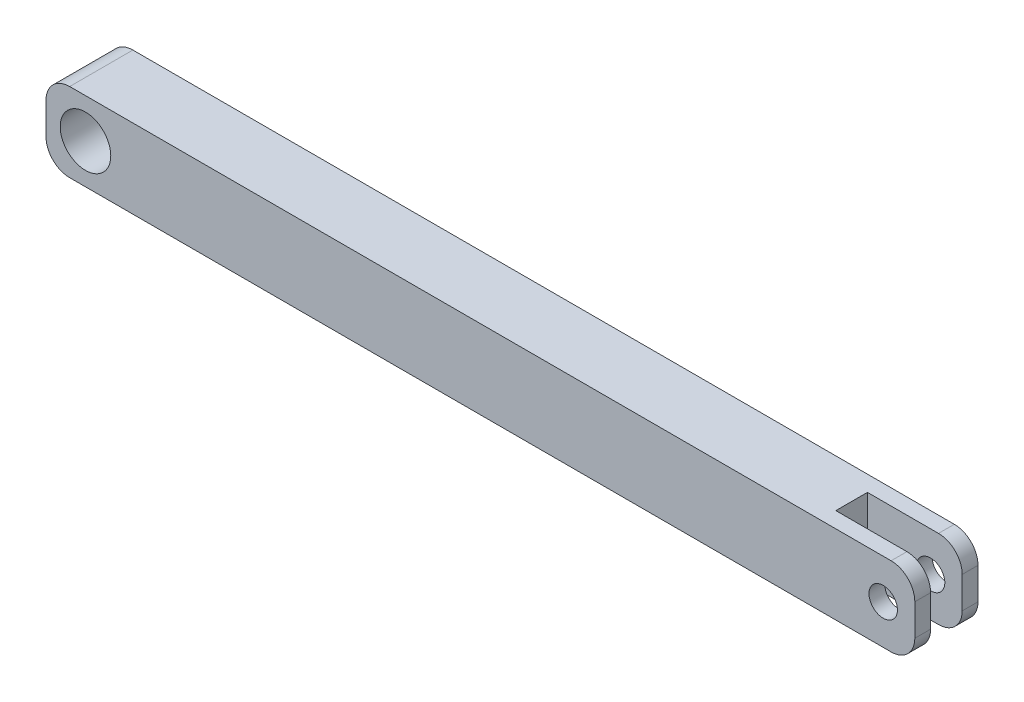
ISO-10303-21;
HEADER;
FILE_DESCRIPTION(('STEP AP214'),'2;1');
FILE_NAME('part.step','',(''),(''),'','','');
FILE_SCHEMA(('AUTOMOTIVE_DESIGN { 1 0 10303 214 1 1 1 1 }'));
ENDSEC;
DATA;
#1=APPLICATION_CONTEXT('core data for automotive mechanical design processes');
#2=APPLICATION_PROTOCOL_DEFINITION('international standard','automotive_design',2000,#1);
#3=PRODUCT_CONTEXT('',#1,'mechanical');
#4=PRODUCT('Part','Part','',(#3));
#5=PRODUCT_RELATED_PRODUCT_CATEGORY('part','',(#4));
#6=PRODUCT_DEFINITION_FORMATION('','',#4);
#7=PRODUCT_DEFINITION_CONTEXT('part definition',#1,'design');
#8=PRODUCT_DEFINITION('design','',#6,#7);
#9=PRODUCT_DEFINITION_SHAPE('','',#8);
#10=(LENGTH_UNIT() NAMED_UNIT(*) SI_UNIT(.MILLI.,.METRE.));
#11=(NAMED_UNIT(*) PLANE_ANGLE_UNIT() SI_UNIT($,.RADIAN.));
#12=(NAMED_UNIT(*) SI_UNIT($,.STERADIAN.) SOLID_ANGLE_UNIT());
#13=UNCERTAINTY_MEASURE_WITH_UNIT(LENGTH_MEASURE(1.E-05),#10,'distance_accuracy_value','');
#14=(GEOMETRIC_REPRESENTATION_CONTEXT(3) GLOBAL_UNCERTAINTY_ASSIGNED_CONTEXT((#13)) GLOBAL_UNIT_ASSIGNED_CONTEXT((#10,
#11,#12)) REPRESENTATION_CONTEXT('',''));
#15=CARTESIAN_POINT('',(0.,0.,0.));
#16=DIRECTION('',(0.,0.,1.));
#17=DIRECTION('',(1.,0.,0.));
#18=AXIS2_PLACEMENT_3D('',#15,#16,#17);
#19=CARTESIAN_POINT('',(55.,5.,3.));
#20=DIRECTION('',(-1.,0.,0.));
#21=DIRECTION('',(0.,0.,1.));
#22=AXIS2_PLACEMENT_3D('',#19,#20,#21);
#23=PLANE('',#22);
#24=DIRECTION('',(0.,0.,-1.));
#25=VECTOR('',#24,1.);
#26=CARTESIAN_POINT('',(55.,1.5,3.));
#27=LINE('',#26,#25);
#28=CARTESIAN_POINT('',(55.,1.5,3.5));
#29=VERTEX_POINT('',#28);
#30=CARTESIAN_POINT('',(55.,1.5,2.5));
#31=VERTEX_POINT('',#30);
#32=EDGE_CURVE('E257',#29,#31,#27,.T.);
#33=ORIENTED_EDGE('',*,*,#32,.T.);
#34=DIRECTION('',(0.,1.,0.));
#35=VECTOR('',#34,1.);
#36=CARTESIAN_POINT('',(55.,5.,2.5));
#37=LINE('',#36,#35);
#38=CARTESIAN_POINT('',(55.,3.5,2.5));
#39=VERTEX_POINT('',#38);
#40=EDGE_CURVE('E182',#31,#39,#37,.T.);
#41=ORIENTED_EDGE('',*,*,#40,.T.);
#42=DIRECTION('',(0.,0.,-1.));
#43=VECTOR('',#42,1.);
#44=CARTESIAN_POINT('',(55.,3.5,3.));
#45=LINE('',#44,#43);
#46=CARTESIAN_POINT('',(55.,3.5,3.5));
#47=VERTEX_POINT('',#46);
#48=EDGE_CURVE('E260',#39,#47,#45,.F.);
#49=ORIENTED_EDGE('',*,*,#48,.T.);
#50=DIRECTION('',(0.,1.,0.));
#51=VECTOR('',#50,1.);
#52=CARTESIAN_POINT('',(55.,1.5,3.5));
#53=LINE('',#52,#51);
#54=EDGE_CURVE('E229',#29,#47,#53,.T.);
#55=ORIENTED_EDGE('',*,*,#54,.F.);
#56=EDGE_LOOP('',(#33,#41,#49,#55));
#57=FACE_BOUND('',#56,.T.);
#58=ADVANCED_FACE('F41',(#57),#23,.F.);
#59=CARTESIAN_POINT('',(53.,2.5,3.001));
#60=DIRECTION('',(0.,0.,-1.));
#61=DIRECTION('',(-1.,0.,0.));
#62=AXIS2_PLACEMENT_3D('',#59,#60,#61);
#63=CYLINDRICAL_SURFACE('',#62,0.900000000000004);
#64=CARTESIAN_POINT('',(53.,2.5,2.5));
#65=DIRECTION('',(0.,0.,1.));
#66=DIRECTION('',(1.,0.,0.));
#67=AXIS2_PLACEMENT_3D('',#64,#65,#66);
#68=CIRCLE('',#67,0.900000000000004);
#69=CARTESIAN_POINT('',(53.9,2.5,2.5));
#70=VERTEX_POINT('',#69);
#71=EDGE_CURVE('E187',#70,#70,#68,.T.);
#72=ORIENTED_EDGE('',*,*,#71,.F.);
#73=EDGE_LOOP('',(#72));
#74=FACE_BOUND('',#73,.T.);
#75=CARTESIAN_POINT('',(53.,2.5,3.5));
#76=DIRECTION('',(0.,0.,1.));
#77=DIRECTION('',(1.,0.,0.));
#78=AXIS2_PLACEMENT_3D('',#75,#76,#77);
#79=CIRCLE('',#78,0.900000000000004);
#80=CARTESIAN_POINT('',(53.9,2.5,3.5));
#81=VERTEX_POINT('',#80);
#82=EDGE_CURVE('E220',#81,#81,#79,.T.);
#83=ORIENTED_EDGE('',*,*,#82,.T.);
#84=EDGE_LOOP('',(#83));
#85=FACE_BOUND('',#84,.T.);
#86=ADVANCED_FACE('F290',(#74,#85),#63,.F.);
#87=CARTESIAN_POINT('',(53.5,3.5,0.));
#88=DIRECTION('',(0.,0.,1.));
#89=DIRECTION('',(1.,0.,0.));
#90=AXIS2_PLACEMENT_3D('',#87,#88,#89);
#91=CYLINDRICAL_SURFACE('',#90,1.5);
#92=CARTESIAN_POINT('',(53.5,3.5,2.5));
#93=DIRECTION('',(0.,0.,1.));
#94=DIRECTION('',(1.,0.,0.));
#95=AXIS2_PLACEMENT_3D('',#92,#93,#94);
#96=CIRCLE('',#95,1.5);
#97=CARTESIAN_POINT('',(53.5,5.,2.5));
#98=VERTEX_POINT('',#97);
#99=EDGE_CURVE('E180',#98,#39,#96,.F.);
#100=ORIENTED_EDGE('',*,*,#99,.F.);
#101=DIRECTION('',(0.,0.,-1.));
#102=VECTOR('',#101,1.);
#103=CARTESIAN_POINT('',(53.5,5.,0.));
#104=LINE('',#103,#102);
#105=CARTESIAN_POINT('',(53.5,5.,3.5));
#106=VERTEX_POINT('',#105);
#107=EDGE_CURVE('E253',#106,#98,#104,.T.);
#108=ORIENTED_EDGE('',*,*,#107,.F.);
#109=CARTESIAN_POINT('',(53.5,3.5,3.5));
#110=DIRECTION('',(0.,0.,1.));
#111=DIRECTION('',(1.,0.,0.));
#112=AXIS2_PLACEMENT_3D('',#109,#110,#111);
#113=CIRCLE('',#112,1.5);
#114=EDGE_CURVE('E232',#47,#106,#113,.T.);
#115=ORIENTED_EDGE('',*,*,#114,.F.);
#116=ORIENTED_EDGE('',*,*,#48,.F.);
#117=EDGE_LOOP('',(#100,#108,#115,#116));
#118=FACE_BOUND('',#117,.T.);
#119=ADVANCED_FACE('F298',(#118),#91,.T.);
#120=CARTESIAN_POINT('',(53.5,1.5,3.));
#121=DIRECTION('',(0.,0.,-1.));
#122=DIRECTION('',(-1.,0.,0.));
#123=AXIS2_PLACEMENT_3D('',#120,#121,#122);
#124=CYLINDRICAL_SURFACE('',#123,1.5);
#125=CARTESIAN_POINT('',(53.5,1.5,2.5));
#126=DIRECTION('',(0.,0.,1.));
#127=DIRECTION('',(1.,0.,0.));
#128=AXIS2_PLACEMENT_3D('',#125,#126,#127);
#129=CIRCLE('',#128,1.5);
#130=CARTESIAN_POINT('',(53.5,0.,2.5));
#131=VERTEX_POINT('',#130);
#132=EDGE_CURVE('E185',#31,#131,#129,.F.);
#133=ORIENTED_EDGE('',*,*,#132,.F.);
#134=ORIENTED_EDGE('',*,*,#32,.F.);
#135=CARTESIAN_POINT('',(53.5,1.5,3.5));
#136=DIRECTION('',(0.,0.,1.));
#137=DIRECTION('',(1.,0.,0.));
#138=AXIS2_PLACEMENT_3D('',#135,#136,#137);
#139=CIRCLE('',#138,1.5);
#140=CARTESIAN_POINT('',(53.5,0.,3.5));
#141=VERTEX_POINT('',#140);
#142=EDGE_CURVE('E226',#141,#29,#139,.T.);
#143=ORIENTED_EDGE('',*,*,#142,.F.);
#144=DIRECTION('',(0.,0.,-1.));
#145=VECTOR('',#144,1.);
#146=CARTESIAN_POINT('',(53.5,0.,0.));
#147=LINE('',#146,#145);
#148=EDGE_CURVE('E56',#131,#141,#147,.F.);
#149=ORIENTED_EDGE('',*,*,#148,.F.);
#150=EDGE_LOOP('',(#133,#134,#143,#149));
#151=FACE_BOUND('',#150,.T.);
#152=ADVANCED_FACE('F288',(#151),#124,.T.);
#153=CARTESIAN_POINT('',(0.,5.,0.));
#154=DIRECTION('',(1.,0.,0.));
#155=DIRECTION('',(0.,0.,-1.));
#156=AXIS2_PLACEMENT_3D('',#153,#154,#155);
#157=PLANE('',#156);
#158=DIRECTION('',(0.,0.,1.));
#159=VECTOR('',#158,1.);
#160=CARTESIAN_POINT('',(0.,3.5,0.));
#161=LINE('',#160,#159);
#162=CARTESIAN_POINT('',(0.,3.5,3.5));
#163=VERTEX_POINT('',#162);
#164=CARTESIAN_POINT('',(0.,3.5,-0.5));
#165=VERTEX_POINT('',#164);
#166=EDGE_CURVE('E266',#163,#165,#161,.F.);
#167=ORIENTED_EDGE('',*,*,#166,.T.);
#168=DIRECTION('',(0.,1.,0.));
#169=VECTOR('',#168,1.);
#170=CARTESIAN_POINT('',(0.,1.5,-0.5));
#171=LINE('',#170,#169);
#172=CARTESIAN_POINT('',(0.,1.5,-0.5));
#173=VERTEX_POINT('',#172);
#174=EDGE_CURVE('E217',#173,#165,#171,.T.);
#175=ORIENTED_EDGE('',*,*,#174,.F.);
#176=DIRECTION('',(0.,0.,1.));
#177=VECTOR('',#176,1.);
#178=CARTESIAN_POINT('',(0.,1.5,0.));
#179=LINE('',#178,#177);
#180=CARTESIAN_POINT('',(0.,1.5,3.5));
#181=VERTEX_POINT('',#180);
#182=EDGE_CURVE('E151',#173,#181,#179,.T.);
#183=ORIENTED_EDGE('',*,*,#182,.T.);
#184=DIRECTION('',(0.,-1.,0.));
#185=VECTOR('',#184,1.);
#186=CARTESIAN_POINT('',(0.,3.5,3.5));
#187=LINE('',#186,#185);
#188=EDGE_CURVE('E241',#163,#181,#187,.T.);
#189=ORIENTED_EDGE('',*,*,#188,.F.);
#190=EDGE_LOOP('',(#167,#175,#183,#189));
#191=FACE_BOUND('',#190,.T.);
#192=ADVANCED_FACE('F271',(#191),#157,.F.);
#193=CARTESIAN_POINT('',(55.,3.5,-0.500000000000004));
#194=VERTEX_POINT('',#193);
#195=CARTESIAN_POINT('',(55.,3.5,0.500000000000001));
#196=VERTEX_POINT('',#195);
#197=EDGE_CURVE('E261',#194,#196,#45,.F.);
#198=ORIENTED_EDGE('',*,*,#197,.T.);
#199=DIRECTION('',(0.,-1.,0.));
#200=VECTOR('',#199,1.);
#201=CARTESIAN_POINT('',(55.,5.,0.500000000000001));
#202=LINE('',#201,#200);
#203=CARTESIAN_POINT('',(55.,1.5,0.500000000000001));
#204=VERTEX_POINT('',#203);
#205=EDGE_CURVE('E168',#196,#204,#202,.T.);
#206=ORIENTED_EDGE('',*,*,#205,.T.);
#207=CARTESIAN_POINT('',(55.,1.5,-0.500000000000004));
#208=VERTEX_POINT('',#207);
#209=EDGE_CURVE('E256',#204,#208,#27,.T.);
#210=ORIENTED_EDGE('',*,*,#209,.T.);
#211=DIRECTION('',(0.,-1.,0.));
#212=VECTOR('',#211,1.);
#213=CARTESIAN_POINT('',(55.,3.5,-0.500000000000004));
#214=LINE('',#213,#212);
#215=EDGE_CURVE('E205',#194,#208,#214,.T.);
#216=ORIENTED_EDGE('',*,*,#215,.F.);
#217=EDGE_LOOP('',(#198,#206,#210,#216));
#218=FACE_BOUND('',#217,.T.);
#219=ADVANCED_FACE('F293',(#218),#23,.F.);
#220=CARTESIAN_POINT('',(0.,5.,0.));
#221=DIRECTION('',(0.,1.,0.));
#222=DIRECTION('',(0.,0.,1.));
#223=AXIS2_PLACEMENT_3D('',#220,#221,#222);
#224=PLANE('',#223);
#225=DIRECTION('',(1.,0.,0.));
#226=VECTOR('',#225,1.);
#227=CARTESIAN_POINT('',(0.,5.,2.5));
#228=LINE('',#227,#226);
#229=CARTESIAN_POINT('',(49.,5.,2.5));
#230=VERTEX_POINT('',#229);
#231=EDGE_CURVE('E178',#230,#98,#228,.T.);
#232=ORIENTED_EDGE('',*,*,#231,.F.);
#233=DIRECTION('',(0.,0.,1.));
#234=VECTOR('',#233,1.);
#235=CARTESIAN_POINT('',(49.,5.,0.700000000000001));
#236=LINE('',#235,#234);
#237=CARTESIAN_POINT('',(49.,5.,0.5));
#238=VERTEX_POINT('',#237);
#239=EDGE_CURVE('E248',#238,#230,#236,.T.);
#240=ORIENTED_EDGE('',*,*,#239,.F.);
#241=DIRECTION('',(-1.,0.,0.));
#242=VECTOR('',#241,1.);
#243=CARTESIAN_POINT('',(0.,5.,0.499999999999994));
#244=LINE('',#243,#242);
#245=CARTESIAN_POINT('',(53.5,5.,0.500000000000001));
#246=VERTEX_POINT('',#245);
#247=EDGE_CURVE('E158',#246,#238,#244,.T.);
#248=ORIENTED_EDGE('',*,*,#247,.F.);
#249=CARTESIAN_POINT('',(53.5,5.,-0.500000000000004));
#250=VERTEX_POINT('',#249);
#251=EDGE_CURVE('E252',#246,#250,#104,.T.);
#252=ORIENTED_EDGE('',*,*,#251,.T.);
#253=DIRECTION('',(1.,0.,0.));
#254=VECTOR('',#253,1.);
#255=CARTESIAN_POINT('',(1.5,5.,-0.5));
#256=LINE('',#255,#254);
#257=CARTESIAN_POINT('',(1.5,5.,-0.5));
#258=VERTEX_POINT('',#257);
#259=EDGE_CURVE('E199',#258,#250,#256,.T.);
#260=ORIENTED_EDGE('',*,*,#259,.F.);
#261=DIRECTION('',(0.,0.,1.));
#262=VECTOR('',#261,1.);
#263=CARTESIAN_POINT('',(1.5,5.,3.));
#264=LINE('',#263,#262);
#265=CARTESIAN_POINT('',(1.5,5.,3.5));
#266=VERTEX_POINT('',#265);
#267=EDGE_CURVE('E250',#258,#266,#264,.T.);
#268=ORIENTED_EDGE('',*,*,#267,.T.);
#269=DIRECTION('',(-1.,0.,0.));
#270=VECTOR('',#269,1.);
#271=CARTESIAN_POINT('',(53.5,5.,3.5));
#272=LINE('',#271,#270);
#273=EDGE_CURVE('E235',#106,#266,#272,.T.);
#274=ORIENTED_EDGE('',*,*,#273,.F.);
#275=ORIENTED_EDGE('',*,*,#107,.T.);
#276=EDGE_LOOP('',(#232,#240,#248,#252,#260,#268,#274,#275));
#277=FACE_BOUND('',#276,.T.);
#278=ADVANCED_FACE('F305',(#277),#224,.T.);
#279=CARTESIAN_POINT('',(0.,0.,0.));
#280=DIRECTION('',(0.,1.,0.));
#281=DIRECTION('',(0.,0.,1.));
#282=AXIS2_PLACEMENT_3D('',#279,#280,#281);
#283=PLANE('',#282);
#284=DIRECTION('',(0.,0.,1.));
#285=VECTOR('',#284,1.);
#286=CARTESIAN_POINT('',(49.,0.,0.));
#287=LINE('',#286,#285);
#288=CARTESIAN_POINT('',(49.,0.,0.5));
#289=VERTEX_POINT('',#288);
#290=CARTESIAN_POINT('',(49.,0.,2.5));
#291=VERTEX_POINT('',#290);
#292=EDGE_CURVE('E49',#289,#291,#287,.T.);
#293=ORIENTED_EDGE('',*,*,#292,.T.);
#294=DIRECTION('',(-1.,0.,0.));
#295=VECTOR('',#294,1.);
#296=CARTESIAN_POINT('',(55.0706118815702,0.,2.5));
#297=LINE('',#296,#295);
#298=EDGE_CURVE('E159',#131,#291,#297,.T.);
#299=ORIENTED_EDGE('',*,*,#298,.F.);
#300=ORIENTED_EDGE('',*,*,#148,.T.);
#301=DIRECTION('',(1.,0.,0.));
#302=VECTOR('',#301,1.);
#303=CARTESIAN_POINT('',(1.5,0.,3.5));
#304=LINE('',#303,#302);
#305=CARTESIAN_POINT('',(1.5,0.,3.5));
#306=VERTEX_POINT('',#305);
#307=EDGE_CURVE('E246',#306,#141,#304,.T.);
#308=ORIENTED_EDGE('',*,*,#307,.F.);
#309=DIRECTION('',(0.,0.,1.));
#310=VECTOR('',#309,1.);
#311=CARTESIAN_POINT('',(1.5,0.,0.));
#312=LINE('',#311,#310);
#313=CARTESIAN_POINT('',(1.5,0.,-0.5));
#314=VERTEX_POINT('',#313);
#315=EDGE_CURVE('E64',#306,#314,#312,.F.);
#316=ORIENTED_EDGE('',*,*,#315,.T.);
#317=DIRECTION('',(-1.,0.,0.));
#318=VECTOR('',#317,1.);
#319=CARTESIAN_POINT('',(53.5,0.,-0.500000000000004));
#320=LINE('',#319,#318);
#321=CARTESIAN_POINT('',(53.5,0.,-0.500000000000004));
#322=VERTEX_POINT('',#321);
#323=EDGE_CURVE('E211',#322,#314,#320,.T.);
#324=ORIENTED_EDGE('',*,*,#323,.F.);
#325=CARTESIAN_POINT('',(53.5,0.,0.500000000000001));
#326=VERTEX_POINT('',#325);
#327=EDGE_CURVE('E164',#322,#326,#147,.F.);
#328=ORIENTED_EDGE('',*,*,#327,.T.);
#329=DIRECTION('',(1.,0.,0.));
#330=VECTOR('',#329,1.);
#331=CARTESIAN_POINT('',(55.0706118815702,0.,0.500000000000001));
#332=LINE('',#331,#330);
#333=EDGE_CURVE('E155',#289,#326,#332,.T.);
#334=ORIENTED_EDGE('',*,*,#333,.F.);
#335=EDGE_LOOP('',(#293,#299,#300,#308,#316,#324,#328,#334));
#336=FACE_BOUND('',#335,.T.);
#337=ADVANCED_FACE('F162',(#336),#283,.F.);
#338=CARTESIAN_POINT('',(2.5,2.5,-0.00100000000000013));
#339=DIRECTION('',(0.,0.,1.));
#340=DIRECTION('',(1.,0.,0.));
#341=AXIS2_PLACEMENT_3D('',#338,#339,#340);
#342=CYLINDRICAL_SURFACE('',#341,1.6);
#343=CARTESIAN_POINT('',(2.5,2.5,3.5));
#344=DIRECTION('',(0.,0.,1.));
#345=DIRECTION('',(1.,0.,0.));
#346=AXIS2_PLACEMENT_3D('',#343,#344,#345);
#347=CIRCLE('',#346,1.6);
#348=CARTESIAN_POINT('',(4.1,2.5,3.5));
#349=VERTEX_POINT('',#348);
#350=EDGE_CURVE('E223',#349,#349,#347,.T.);
#351=CARTESIAN_POINT('',(2.5,2.5,-0.5));
#352=DIRECTION('',(0.,0.,-1.));
#353=DIRECTION('',(-1.,0.,0.));
#354=AXIS2_PLACEMENT_3D('',#351,#352,#353);
#355=CIRCLE('',#354,1.6);
#356=CARTESIAN_POINT('',(4.1,2.5,-0.5));
#357=VERTEX_POINT('',#356);
#358=EDGE_CURVE('E190',#357,#357,#355,.T.);
#359=CARTESIAN_POINT('',(4.1,2.5,3.5));
#360=CARTESIAN_POINT('',(4.1,2.5,3.45833333333333));
#361=CARTESIAN_POINT('',(4.1,2.5,3.41666666666667));
#362=CARTESIAN_POINT('',(4.1,2.5,3.33333333333333));
#363=CARTESIAN_POINT('',(4.1,2.5,3.29166666666667));
#364=CARTESIAN_POINT('',(4.1,2.5,3.20833333333333));
#365=CARTESIAN_POINT('',(4.1,2.5,3.16666666666667));
#366=CARTESIAN_POINT('',(4.1,2.5,3.08333333333333));
#367=CARTESIAN_POINT('',(4.1,2.5,3.04166666666667));
#368=CARTESIAN_POINT('',(4.1,2.5,2.95833333333333));
#369=CARTESIAN_POINT('',(4.1,2.5,2.91666666666667));
#370=CARTESIAN_POINT('',(4.1,2.5,2.83333333333333));
#371=CARTESIAN_POINT('',(4.1,2.5,2.79166666666667));
#372=CARTESIAN_POINT('',(4.1,2.5,2.70833333333333));
#373=CARTESIAN_POINT('',(4.1,2.5,2.66666666666667));
#374=CARTESIAN_POINT('',(4.1,2.5,2.58333333333333));
#375=CARTESIAN_POINT('',(4.1,2.5,2.54166666666667));
#376=CARTESIAN_POINT('',(4.1,2.5,2.45833333333333));
#377=CARTESIAN_POINT('',(4.1,2.5,2.41666666666667));
#378=CARTESIAN_POINT('',(4.1,2.5,2.33333333333333));
#379=CARTESIAN_POINT('',(4.1,2.5,2.29166666666667));
#380=CARTESIAN_POINT('',(4.1,2.5,2.20833333333333));
#381=CARTESIAN_POINT('',(4.1,2.5,2.16666666666667));
#382=CARTESIAN_POINT('',(4.1,2.5,2.08333333333333));
#383=CARTESIAN_POINT('',(4.1,2.5,2.04166666666667));
#384=CARTESIAN_POINT('',(4.1,2.5,1.95833333333333));
#385=CARTESIAN_POINT('',(4.1,2.5,1.91666666666667));
#386=CARTESIAN_POINT('',(4.1,2.5,1.83333333333333));
#387=CARTESIAN_POINT('',(4.1,2.5,1.79166666666667));
#388=CARTESIAN_POINT('',(4.1,2.5,1.70833333333333));
#389=CARTESIAN_POINT('',(4.1,2.5,1.66666666666667));
#390=CARTESIAN_POINT('',(4.1,2.5,1.58333333333333));
#391=CARTESIAN_POINT('',(4.1,2.5,1.54166666666667));
#392=CARTESIAN_POINT('',(4.1,2.5,1.45833333333333));
#393=CARTESIAN_POINT('',(4.1,2.5,1.41666666666667));
#394=CARTESIAN_POINT('',(4.1,2.5,1.33333333333333));
#395=CARTESIAN_POINT('',(4.1,2.5,1.29166666666667));
#396=CARTESIAN_POINT('',(4.1,2.5,1.20833333333333));
#397=CARTESIAN_POINT('',(4.1,2.5,1.16666666666667));
#398=CARTESIAN_POINT('',(4.1,2.5,1.08333333333333));
#399=CARTESIAN_POINT('',(4.1,2.5,1.04166666666667));
#400=CARTESIAN_POINT('',(4.1,2.5,0.958333333333333));
#401=CARTESIAN_POINT('',(4.1,2.5,0.916666666666666));
#402=CARTESIAN_POINT('',(4.1,2.5,0.833333333333333));
#403=CARTESIAN_POINT('',(4.1,2.5,0.791666666666666));
#404=CARTESIAN_POINT('',(4.1,2.5,0.708333333333333));
#405=CARTESIAN_POINT('',(4.1,2.5,0.666666666666666));
#406=CARTESIAN_POINT('',(4.1,2.5,0.583333333333333));
#407=CARTESIAN_POINT('',(4.1,2.5,0.541666666666666));
#408=CARTESIAN_POINT('',(4.1,2.5,0.458333333333333));
#409=CARTESIAN_POINT('',(4.1,2.5,0.416666666666666));
#410=CARTESIAN_POINT('',(4.1,2.5,0.333333333333333));
#411=CARTESIAN_POINT('',(4.1,2.5,0.291666666666666));
#412=CARTESIAN_POINT('',(4.1,2.5,0.208333333333333));
#413=CARTESIAN_POINT('',(4.1,2.5,0.166666666666666));
#414=CARTESIAN_POINT('',(4.1,2.5,0.083333333333333));
#415=CARTESIAN_POINT('',(4.1,2.5,0.0416666666666663));
#416=CARTESIAN_POINT('',(4.1,2.5,-0.0416666666666671));
#417=CARTESIAN_POINT('',(4.1,2.5,-0.0833333333333338));
#418=CARTESIAN_POINT('',(4.1,2.5,-0.166666666666667));
#419=CARTESIAN_POINT('',(4.1,2.5,-0.208333333333334));
#420=CARTESIAN_POINT('',(4.1,2.5,-0.291666666666667));
#421=CARTESIAN_POINT('',(4.1,2.5,-0.333333333333334));
#422=CARTESIAN_POINT('',(4.1,2.5,-0.416666666666667));
#423=CARTESIAN_POINT('',(4.1,2.5,-0.458333333333334));
#424=CARTESIAN_POINT('',(4.1,2.5,-0.5));
#425=B_SPLINE_CURVE_WITH_KNOTS('',3,(#359,#360,#361,#362,#363,#364,#365,#366,#367,#368,#369,
#370,#371,#372,#373,#374,#375,#376,#377,#378,#379,#380,#381,#382,#383,#384,#385,#386,#387,#388,
#389,#390,#391,#392,#393,#394,#395,#396,#397,#398,#399,#400,#401,#402,#403,#404,#405,#406,#407,
#408,#409,#410,#411,#412,#413,#414,#415,#416,#417,#418,#419,#420,#421,#422,#423,#424),
.UNSPECIFIED.,.F.,.F.,(4,2,2,2,2,2,2,2,2,2,2,2,2,2,2,2,2,2,2,2,2,2,2,2,2,2,2,2,2,2,2,2,4),(0.,
0.125,0.25,0.375,0.5,0.625,0.75,0.875,1.,1.125,1.25,1.375,1.5,1.625,1.75,1.875,2.,2.125,2.25,
2.375,2.5,2.625,2.75,2.875,3.,3.125,3.25,3.375,3.5,3.625,3.75,3.875,4.),.UNSPECIFIED.);
#426=EDGE_CURVE('BSEAM346',#349,#357,#425,.T.);
#427=ORIENTED_EDGE('',*,*,#350,.T.);
#428=ORIENTED_EDGE('',*,*,#358,.T.);
#429=ORIENTED_EDGE('',*,*,#426,.T.);
#430=ORIENTED_EDGE('',*,*,#426,.F.);
#431=EDGE_LOOP('',(#427,#429,#428,#430));
#432=FACE_BOUND('',#431,.T.);
#433=ADVANCED_FACE('F346',(#432),#342,.F.);
#434=CARTESIAN_POINT('',(53.,2.5,0.5));
#435=DIRECTION('',(0.,0.,-1.));
#436=DIRECTION('',(-1.,0.,0.));
#437=AXIS2_PLACEMENT_3D('',#434,#435,#436);
#438=CIRCLE('',#437,0.900000000000004);
#439=CARTESIAN_POINT('',(52.1,2.5,0.5));
#440=VERTEX_POINT('',#439);
#441=EDGE_CURVE('E175',#440,#440,#438,.T.);
#442=ORIENTED_EDGE('',*,*,#441,.F.);
#443=EDGE_LOOP('',(#442));
#444=FACE_BOUND('',#443,.T.);
#445=CARTESIAN_POINT('',(53.,2.5,-0.500000000000004));
#446=DIRECTION('',(0.,0.,-1.));
#447=DIRECTION('',(-1.,0.,0.));
#448=AXIS2_PLACEMENT_3D('',#445,#446,#447);
#449=CIRCLE('',#448,0.900000000000004);
#450=CARTESIAN_POINT('',(52.1,2.5,-0.500000000000004));
#451=VERTEX_POINT('',#450);
#452=EDGE_CURVE('E193',#451,#451,#449,.T.);
#453=ORIENTED_EDGE('',*,*,#452,.T.);
#454=EDGE_LOOP('',(#453));
#455=FACE_BOUND('',#454,.T.);
#456=ADVANCED_FACE('F301',(#444,#455),#63,.F.);
#457=CARTESIAN_POINT('',(53.5,3.5,0.500000000000001));
#458=DIRECTION('',(0.,0.,-1.));
#459=DIRECTION('',(-1.,0.,0.));
#460=AXIS2_PLACEMENT_3D('',#457,#458,#459);
#461=CIRCLE('',#460,1.5);
#462=EDGE_CURVE('E172',#196,#246,#461,.F.);
#463=ORIENTED_EDGE('',*,*,#462,.F.);
#464=ORIENTED_EDGE('',*,*,#197,.F.);
#465=CARTESIAN_POINT('',(53.5,3.5,-0.500000000000004));
#466=DIRECTION('',(0.,0.,-1.));
#467=DIRECTION('',(-1.,0.,0.));
#468=AXIS2_PLACEMENT_3D('',#465,#466,#467);
#469=CIRCLE('',#468,1.5);
#470=EDGE_CURVE('E202',#250,#194,#469,.T.);
#471=ORIENTED_EDGE('',*,*,#470,.F.);
#472=ORIENTED_EDGE('',*,*,#251,.F.);
#473=EDGE_LOOP('',(#463,#464,#471,#472));
#474=FACE_BOUND('',#473,.T.);
#475=ADVANCED_FACE('F285',(#474),#91,.T.);
#476=CARTESIAN_POINT('',(53.5,1.5,0.500000000000001));
#477=DIRECTION('',(0.,0.,-1.));
#478=DIRECTION('',(-1.,0.,0.));
#479=AXIS2_PLACEMENT_3D('',#476,#477,#478);
#480=CIRCLE('',#479,1.5);
#481=EDGE_CURVE('E11',#326,#204,#480,.F.);
#482=ORIENTED_EDGE('',*,*,#481,.F.);
#483=ORIENTED_EDGE('',*,*,#327,.F.);
#484=CARTESIAN_POINT('',(53.5,1.5,-0.500000000000004));
#485=DIRECTION('',(0.,0.,-1.));
#486=DIRECTION('',(-1.,0.,0.));
#487=AXIS2_PLACEMENT_3D('',#484,#485,#486);
#488=CIRCLE('',#487,1.5);
#489=EDGE_CURVE('E208',#208,#322,#488,.T.);
#490=ORIENTED_EDGE('',*,*,#489,.F.);
#491=ORIENTED_EDGE('',*,*,#209,.F.);
#492=EDGE_LOOP('',(#482,#483,#490,#491));
#493=FACE_BOUND('',#492,.T.);
#494=ADVANCED_FACE('F278',(#493),#124,.T.);
#495=CARTESIAN_POINT('',(1.5,1.5,0.));
#496=DIRECTION('',(0.,0.,1.));
#497=DIRECTION('',(1.,0.,0.));
#498=AXIS2_PLACEMENT_3D('',#495,#496,#497);
#499=CYLINDRICAL_SURFACE('',#498,1.5);
#500=ORIENTED_EDGE('',*,*,#182,.F.);
#501=CARTESIAN_POINT('',(1.5,1.5,-0.5));
#502=DIRECTION('',(0.,0.,-1.));
#503=DIRECTION('',(-1.,0.,0.));
#504=AXIS2_PLACEMENT_3D('',#501,#502,#503);
#505=CIRCLE('',#504,1.5);
#506=EDGE_CURVE('E214',#314,#173,#505,.T.);
#507=ORIENTED_EDGE('',*,*,#506,.F.);
#508=ORIENTED_EDGE('',*,*,#315,.F.);
#509=CARTESIAN_POINT('',(1.5,1.5,3.5));
#510=DIRECTION('',(0.,0.,1.));
#511=DIRECTION('',(1.,0.,0.));
#512=AXIS2_PLACEMENT_3D('',#509,#510,#511);
#513=CIRCLE('',#512,1.5);
#514=EDGE_CURVE('E244',#181,#306,#513,.T.);
#515=ORIENTED_EDGE('',*,*,#514,.F.);
#516=EDGE_LOOP('',(#500,#507,#508,#515));
#517=FACE_BOUND('',#516,.T.);
#518=ADVANCED_FACE('F276',(#517),#499,.T.);
#519=CARTESIAN_POINT('',(1.5,3.5,0.));
#520=DIRECTION('',(0.,0.,-1.));
#521=DIRECTION('',(-1.,0.,0.));
#522=AXIS2_PLACEMENT_3D('',#519,#520,#521);
#523=CYLINDRICAL_SURFACE('',#522,1.5);
#524=ORIENTED_EDGE('',*,*,#267,.F.);
#525=CARTESIAN_POINT('',(1.5,3.5,-0.5));
#526=DIRECTION('',(0.,0.,-1.));
#527=DIRECTION('',(-1.,0.,0.));
#528=AXIS2_PLACEMENT_3D('',#525,#526,#527);
#529=CIRCLE('',#528,1.5);
#530=EDGE_CURVE('E196',#165,#258,#529,.T.);
#531=ORIENTED_EDGE('',*,*,#530,.F.);
#532=ORIENTED_EDGE('',*,*,#166,.F.);
#533=CARTESIAN_POINT('',(1.5,3.5,3.5));
#534=DIRECTION('',(0.,0.,1.));
#535=DIRECTION('',(1.,0.,0.));
#536=AXIS2_PLACEMENT_3D('',#533,#534,#535);
#537=CIRCLE('',#536,1.5);
#538=EDGE_CURVE('E238',#266,#163,#537,.T.);
#539=ORIENTED_EDGE('',*,*,#538,.F.);
#540=EDGE_LOOP('',(#524,#531,#532,#539));
#541=FACE_BOUND('',#540,.T.);
#542=ADVANCED_FACE('F43',(#541),#523,.T.);
#543=CARTESIAN_POINT('',(49.,-5.,0.700000000000001));
#544=DIRECTION('',(-1.,0.,0.));
#545=DIRECTION('',(0.,0.,1.));
#546=AXIS2_PLACEMENT_3D('',#543,#544,#545);
#547=PLANE('',#546);
#548=ORIENTED_EDGE('',*,*,#292,.F.);
#549=DIRECTION('',(0.,-1.,0.));
#550=VECTOR('',#549,1.);
#551=CARTESIAN_POINT('',(49.,10.,0.5));
#552=LINE('',#551,#550);
#553=EDGE_CURVE('E146',#238,#289,#552,.T.);
#554=ORIENTED_EDGE('',*,*,#553,.F.);
#555=ORIENTED_EDGE('',*,*,#239,.T.);
#556=DIRECTION('',(0.,-1.,0.));
#557=VECTOR('',#556,1.);
#558=CARTESIAN_POINT('',(49.,10.,2.5));
#559=LINE('',#558,#557);
#560=EDGE_CURVE('E148',#230,#291,#559,.T.);
#561=ORIENTED_EDGE('',*,*,#560,.T.);
#562=EDGE_LOOP('',(#548,#554,#555,#561));
#563=FACE_BOUND('',#562,.T.);
#564=ADVANCED_FACE('F145',(#563),#547,.F.);
#565=CARTESIAN_POINT('',(53.5,1.5,3.5));
#566=DIRECTION('',(0.,0.,1.));
#567=DIRECTION('',(1.,0.,0.));
#568=AXIS2_PLACEMENT_3D('',#565,#566,#567);
#569=PLANE('',#568);
#570=ORIENTED_EDGE('',*,*,#350,.F.);
#571=EDGE_LOOP('',(#570));
#572=FACE_BOUND('',#571,.T.);
#573=ORIENTED_EDGE('',*,*,#142,.T.);
#574=ORIENTED_EDGE('',*,*,#54,.T.);
#575=ORIENTED_EDGE('',*,*,#114,.T.);
#576=ORIENTED_EDGE('',*,*,#273,.T.);
#577=ORIENTED_EDGE('',*,*,#538,.T.);
#578=ORIENTED_EDGE('',*,*,#188,.T.);
#579=ORIENTED_EDGE('',*,*,#514,.T.);
#580=ORIENTED_EDGE('',*,*,#307,.T.);
#581=EDGE_LOOP('',(#573,#574,#575,#576,#577,#578,#579,#580));
#582=FACE_BOUND('',#581,.T.);
#583=ORIENTED_EDGE('',*,*,#82,.F.);
#584=EDGE_LOOP('',(#583));
#585=FACE_BOUND('',#584,.T.);
#586=ADVANCED_FACE('F273',(#572,#582,#585),#569,.T.);
#587=CARTESIAN_POINT('',(1.5,3.5,-0.5));
#588=DIRECTION('',(0.,0.,-1.));
#589=DIRECTION('',(-1.,0.,0.));
#590=AXIS2_PLACEMENT_3D('',#587,#588,#589);
#591=PLANE('',#590);
#592=ORIENTED_EDGE('',*,*,#452,.F.);
#593=EDGE_LOOP('',(#592));
#594=FACE_BOUND('',#593,.T.);
#595=ORIENTED_EDGE('',*,*,#530,.T.);
#596=ORIENTED_EDGE('',*,*,#259,.T.);
#597=ORIENTED_EDGE('',*,*,#470,.T.);
#598=ORIENTED_EDGE('',*,*,#215,.T.);
#599=ORIENTED_EDGE('',*,*,#489,.T.);
#600=ORIENTED_EDGE('',*,*,#323,.T.);
#601=ORIENTED_EDGE('',*,*,#506,.T.);
#602=ORIENTED_EDGE('',*,*,#174,.T.);
#603=EDGE_LOOP('',(#595,#596,#597,#598,#599,#600,#601,#602));
#604=FACE_BOUND('',#603,.T.);
#605=ORIENTED_EDGE('',*,*,#358,.F.);
#606=EDGE_LOOP('',(#605));
#607=FACE_BOUND('',#606,.T.);
#608=ADVANCED_FACE('F321',(#594,#604,#607),#591,.T.);
#609=CARTESIAN_POINT('',(55.0706118815702,10.,0.500000000000001));
#610=DIRECTION('',(0.,0.,-1.));
#611=DIRECTION('',(-1.,0.,0.));
#612=AXIS2_PLACEMENT_3D('',#609,#610,#611);
#613=PLANE('',#612);
#614=ORIENTED_EDGE('',*,*,#441,.T.);
#615=EDGE_LOOP('',(#614));
#616=FACE_BOUND('',#615,.T.);
#617=ORIENTED_EDGE('',*,*,#247,.T.);
#618=ORIENTED_EDGE('',*,*,#553,.T.);
#619=ORIENTED_EDGE('',*,*,#333,.T.);
#620=ORIENTED_EDGE('',*,*,#481,.T.);
#621=ORIENTED_EDGE('',*,*,#205,.F.);
#622=ORIENTED_EDGE('',*,*,#462,.T.);
#623=EDGE_LOOP('',(#617,#618,#619,#620,#621,#622));
#624=FACE_BOUND('',#623,.T.);
#625=ADVANCED_FACE('F154',(#616,#624),#613,.F.);
#626=CARTESIAN_POINT('',(55.0706118815702,10.,2.5));
#627=DIRECTION('',(0.,0.,1.));
#628=DIRECTION('',(1.,0.,0.));
#629=AXIS2_PLACEMENT_3D('',#626,#627,#628);
#630=PLANE('',#629);
#631=ORIENTED_EDGE('',*,*,#71,.T.);
#632=EDGE_LOOP('',(#631));
#633=FACE_BOUND('',#632,.T.);
#634=ORIENTED_EDGE('',*,*,#132,.T.);
#635=ORIENTED_EDGE('',*,*,#298,.T.);
#636=ORIENTED_EDGE('',*,*,#560,.F.);
#637=ORIENTED_EDGE('',*,*,#231,.T.);
#638=ORIENTED_EDGE('',*,*,#99,.T.);
#639=ORIENTED_EDGE('',*,*,#40,.F.);
#640=EDGE_LOOP('',(#634,#635,#636,#637,#638,#639));
#641=FACE_BOUND('',#640,.T.);
#642=ADVANCED_FACE('F329',(#633,#641),#630,.F.);
#643=CLOSED_SHELL('',(#58,#86,#119,#152,#192,#219,#278,#337,#433,#456,#475,#494,#518,#542,#564,
#586,#608,#625,#642));
#644=MANIFOLD_SOLID_BREP('B2',#643);
#645=ADVANCED_BREP_SHAPE_REPRESENTATION('',(#18,#644),#14);
#646=SHAPE_DEFINITION_REPRESENTATION(#9,#645);
ENDSEC;
END-ISO-10303-21;
